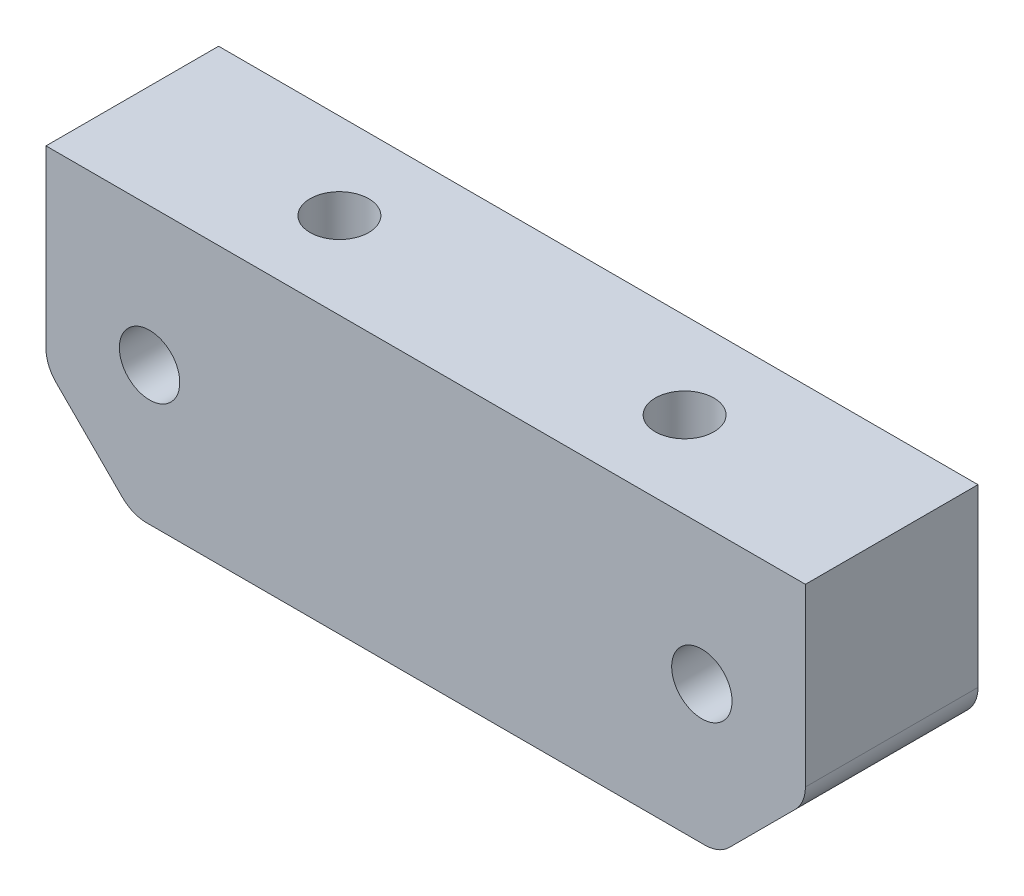
ISO-10303-21;
HEADER;
FILE_DESCRIPTION(('STEP AP214'),'2;1');
FILE_NAME('part.step','',(''),(''),'','','');
FILE_SCHEMA(('AUTOMOTIVE_DESIGN { 1 0 10303 214 1 1 1 1 }'));
ENDSEC;
DATA;
#1=APPLICATION_CONTEXT('core data for automotive mechanical design processes');
#2=APPLICATION_PROTOCOL_DEFINITION('international standard','automotive_design',2000,#1);
#3=PRODUCT_CONTEXT('',#1,'mechanical');
#4=PRODUCT('Part','Part','',(#3));
#5=PRODUCT_RELATED_PRODUCT_CATEGORY('part','',(#4));
#6=PRODUCT_DEFINITION_FORMATION('','',#4);
#7=PRODUCT_DEFINITION_CONTEXT('part definition',#1,'design');
#8=PRODUCT_DEFINITION('design','',#6,#7);
#9=PRODUCT_DEFINITION_SHAPE('','',#8);
#10=(LENGTH_UNIT() NAMED_UNIT(*) SI_UNIT(.MILLI.,.METRE.));
#11=(NAMED_UNIT(*) PLANE_ANGLE_UNIT() SI_UNIT($,.RADIAN.));
#12=(NAMED_UNIT(*) SI_UNIT($,.STERADIAN.) SOLID_ANGLE_UNIT());
#13=UNCERTAINTY_MEASURE_WITH_UNIT(LENGTH_MEASURE(1.E-05),#10,'distance_accuracy_value','');
#14=(GEOMETRIC_REPRESENTATION_CONTEXT(3) GLOBAL_UNCERTAINTY_ASSIGNED_CONTEXT((#13)) GLOBAL_UNIT_ASSIGNED_CONTEXT((#10,
#11,#12)) REPRESENTATION_CONTEXT('',''));
#15=CARTESIAN_POINT('',(0.,0.,0.));
#16=DIRECTION('',(0.,0.,1.));
#17=DIRECTION('',(1.,0.,0.));
#18=AXIS2_PLACEMENT_3D('',#15,#16,#17);
#19=CARTESIAN_POINT('',(10.,17.,5.));
#20=DIRECTION('',(0.,-1.,0.));
#21=DIRECTION('',(0.,0.,-1.));
#22=AXIS2_PLACEMENT_3D('',#19,#20,#21);
#23=CYLINDRICAL_SURFACE('',#22,1.7);
#24=CARTESIAN_POINT('',(10.,8.,5.));
#25=DIRECTION('',(0.,-1.,0.));
#26=DIRECTION('',(0.,0.,-1.));
#27=AXIS2_PLACEMENT_3D('',#24,#25,#26);
#28=CIRCLE('',#27,1.7);
#29=CARTESIAN_POINT('',(10.,8.,3.30000000000001));
#30=VERTEX_POINT('',#29);
#31=EDGE_CURVE('E166',#30,#30,#28,.T.);
#32=ORIENTED_EDGE('',*,*,#31,.F.);
#33=EDGE_LOOP('',(#32));
#34=FACE_BOUND('',#33,.T.);
#35=CARTESIAN_POINT('',(10.,-4.,5.));
#36=DIRECTION('',(0.,-1.,0.));
#37=DIRECTION('',(0.,0.,-1.));
#38=AXIS2_PLACEMENT_3D('',#35,#36,#37);
#39=CIRCLE('',#38,1.7);
#40=CARTESIAN_POINT('',(10.,-4.,3.30000000000001));
#41=VERTEX_POINT('',#40);
#42=EDGE_CURVE('E43',#41,#41,#39,.F.);
#43=ORIENTED_EDGE('',*,*,#42,.F.);
#44=EDGE_LOOP('',(#43));
#45=FACE_BOUND('',#44,.T.);
#46=ADVANCED_FACE('F39',(#34,#45),#23,.F.);
#47=CARTESIAN_POINT('',(-10.,17.,5.));
#48=DIRECTION('',(0.,-1.,0.));
#49=DIRECTION('',(0.,0.,-1.));
#50=AXIS2_PLACEMENT_3D('',#47,#48,#49);
#51=CYLINDRICAL_SURFACE('',#50,1.7);
#52=CARTESIAN_POINT('',(-10.,8.,5.));
#53=DIRECTION('',(0.,-1.,0.));
#54=DIRECTION('',(0.,0.,-1.));
#55=AXIS2_PLACEMENT_3D('',#52,#53,#54);
#56=CIRCLE('',#55,1.7);
#57=CARTESIAN_POINT('',(-10.,8.,3.3));
#58=VERTEX_POINT('',#57);
#59=EDGE_CURVE('E256',#58,#58,#56,.T.);
#60=ORIENTED_EDGE('',*,*,#59,.F.);
#61=EDGE_LOOP('',(#60));
#62=FACE_BOUND('',#61,.T.);
#63=CARTESIAN_POINT('',(-10.,-4.,5.));
#64=DIRECTION('',(0.,-1.,0.));
#65=DIRECTION('',(0.,0.,-1.));
#66=AXIS2_PLACEMENT_3D('',#63,#64,#65);
#67=CIRCLE('',#66,1.7);
#68=CARTESIAN_POINT('',(-10.,-4.,3.3));
#69=VERTEX_POINT('',#68);
#70=EDGE_CURVE('E220',#69,#69,#67,.F.);
#71=ORIENTED_EDGE('',*,*,#70,.F.);
#72=EDGE_LOOP('',(#71));
#73=FACE_BOUND('',#72,.T.);
#74=ADVANCED_FACE('F313',(#62,#73),#51,.F.);
#75=CARTESIAN_POINT('',(22.,-8.,10.));
#76=DIRECTION('',(-1.,0.,0.));
#77=DIRECTION('',(0.,0.,1.));
#78=AXIS2_PLACEMENT_3D('',#75,#76,#77);
#79=PLANE('',#78);
#80=DIRECTION('',(0.,1.,0.));
#81=VECTOR('',#80,1.);
#82=CARTESIAN_POINT('',(22.,-8.,10.));
#83=LINE('',#82,#81);
#84=CARTESIAN_POINT('',(22.,-2.17157287525379,10.));
#85=VERTEX_POINT('',#84);
#86=CARTESIAN_POINT('',(22.,8.,10.));
#87=VERTEX_POINT('',#86);
#88=EDGE_CURVE('E117',#85,#87,#83,.T.);
#89=ORIENTED_EDGE('',*,*,#88,.F.);
#90=DIRECTION('',(0.,0.,1.));
#91=VECTOR('',#90,1.);
#92=CARTESIAN_POINT('',(22.,-2.17157287525379,0.));
#93=LINE('',#92,#91);
#94=CARTESIAN_POINT('',(22.,-2.17157287525379,0.));
#95=VERTEX_POINT('',#94);
#96=EDGE_CURVE('E177',#85,#95,#93,.F.);
#97=ORIENTED_EDGE('',*,*,#96,.T.);
#98=DIRECTION('',(0.,1.,0.));
#99=VECTOR('',#98,1.);
#100=CARTESIAN_POINT('',(22.,-8.,0.));
#101=LINE('',#100,#99);
#102=CARTESIAN_POINT('',(22.,8.,0.));
#103=VERTEX_POINT('',#102);
#104=EDGE_CURVE('E144',#95,#103,#101,.T.);
#105=ORIENTED_EDGE('',*,*,#104,.T.);
#106=DIRECTION('',(0.,0.,-1.));
#107=VECTOR('',#106,1.);
#108=CARTESIAN_POINT('',(22.,8.,10.));
#109=LINE('',#108,#107);
#110=EDGE_CURVE('E135',#87,#103,#109,.T.);
#111=ORIENTED_EDGE('',*,*,#110,.F.);
#112=EDGE_LOOP('',(#89,#97,#105,#111));
#113=FACE_BOUND('',#112,.T.);
#114=ADVANCED_FACE('F142',(#113),#79,.F.);
#115=CARTESIAN_POINT('',(-22.,8.,10.));
#116=DIRECTION('',(0.,-1.,0.));
#117=DIRECTION('',(0.,0.,-1.));
#118=AXIS2_PLACEMENT_3D('',#115,#116,#117);
#119=PLANE('',#118);
#120=ORIENTED_EDGE('',*,*,#59,.T.);
#121=EDGE_LOOP('',(#120));
#122=FACE_BOUND('',#121,.T.);
#123=ORIENTED_EDGE('',*,*,#31,.T.);
#124=EDGE_LOOP('',(#123));
#125=FACE_BOUND('',#124,.T.);
#126=DIRECTION('',(-1.,0.,0.));
#127=VECTOR('',#126,1.);
#128=CARTESIAN_POINT('',(-22.,8.,0.));
#129=LINE('',#128,#127);
#130=CARTESIAN_POINT('',(-22.,8.,0.));
#131=VERTEX_POINT('',#130);
#132=EDGE_CURVE('E267',#103,#131,#129,.T.);
#133=ORIENTED_EDGE('',*,*,#132,.T.);
#134=DIRECTION('',(0.,0.,-1.));
#135=VECTOR('',#134,1.);
#136=CARTESIAN_POINT('',(-22.,8.,10.));
#137=LINE('',#136,#135);
#138=CARTESIAN_POINT('',(-22.,8.,10.));
#139=VERTEX_POINT('',#138);
#140=EDGE_CURVE('E137',#139,#131,#137,.T.);
#141=ORIENTED_EDGE('',*,*,#140,.F.);
#142=DIRECTION('',(-1.,0.,0.));
#143=VECTOR('',#142,1.);
#144=CARTESIAN_POINT('',(-22.,8.,10.));
#145=LINE('',#144,#143);
#146=EDGE_CURVE('E121',#87,#139,#145,.T.);
#147=ORIENTED_EDGE('',*,*,#146,.F.);
#148=ORIENTED_EDGE('',*,*,#110,.T.);
#149=EDGE_LOOP('',(#133,#141,#147,#148));
#150=FACE_BOUND('',#149,.T.);
#151=ADVANCED_FACE('F134',(#122,#125,#150),#119,.F.);
#152=CARTESIAN_POINT('',(-22.,-8.,10.));
#153=DIRECTION('',(1.,0.,0.));
#154=DIRECTION('',(0.,0.,-1.));
#155=AXIS2_PLACEMENT_3D('',#152,#153,#154);
#156=PLANE('',#155);
#157=DIRECTION('',(0.,-1.,0.));
#158=VECTOR('',#157,1.);
#159=CARTESIAN_POINT('',(-22.,-8.,0.));
#160=LINE('',#159,#158);
#161=CARTESIAN_POINT('',(-22.,-2.17157287525379,0.));
#162=VERTEX_POINT('',#161);
#163=EDGE_CURVE('E270',#131,#162,#160,.T.);
#164=ORIENTED_EDGE('',*,*,#163,.T.);
#165=DIRECTION('',(0.,0.,-1.));
#166=VECTOR('',#165,1.);
#167=CARTESIAN_POINT('',(-22.,-2.17157287525379,10.));
#168=LINE('',#167,#166);
#169=CARTESIAN_POINT('',(-22.,-2.17157287525379,10.));
#170=VERTEX_POINT('',#169);
#171=EDGE_CURVE('E11',#162,#170,#168,.F.);
#172=ORIENTED_EDGE('',*,*,#171,.T.);
#173=DIRECTION('',(0.,-1.,0.));
#174=VECTOR('',#173,1.);
#175=CARTESIAN_POINT('',(-22.,-8.,10.));
#176=LINE('',#175,#174);
#177=EDGE_CURVE('E140',#139,#170,#176,.T.);
#178=ORIENTED_EDGE('',*,*,#177,.F.);
#179=ORIENTED_EDGE('',*,*,#140,.T.);
#180=EDGE_LOOP('',(#164,#172,#178,#179));
#181=FACE_BOUND('',#180,.T.);
#182=ADVANCED_FACE('F296',(#181),#156,.F.);
#183=CARTESIAN_POINT('',(-22.,-8.,10.));
#184=DIRECTION('',(0.,1.,0.));
#185=DIRECTION('',(0.,0.,1.));
#186=AXIS2_PLACEMENT_3D('',#183,#184,#185);
#187=PLANE('',#186);
#188=CARTESIAN_POINT('',(10.,-8.,5.));
#189=DIRECTION('',(0.,-1.,0.));
#190=DIRECTION('',(0.,0.,-1.));
#191=AXIS2_PLACEMENT_3D('',#188,#189,#190);
#192=CIRCLE('',#191,3.5);
#193=CARTESIAN_POINT('',(10.,-8.,1.5));
#194=VERTEX_POINT('',#193);
#195=EDGE_CURVE('E231',#194,#194,#192,.T.);
#196=ORIENTED_EDGE('',*,*,#195,.F.);
#197=EDGE_LOOP('',(#196));
#198=FACE_BOUND('',#197,.T.);
#199=CARTESIAN_POINT('',(-10.,-8.,5.));
#200=DIRECTION('',(0.,-1.,0.));
#201=DIRECTION('',(0.,0.,-1.));
#202=AXIS2_PLACEMENT_3D('',#199,#200,#201);
#203=CIRCLE('',#202,3.5);
#204=CARTESIAN_POINT('',(-10.,-8.,1.5));
#205=VERTEX_POINT('',#204);
#206=EDGE_CURVE('E243',#205,#205,#203,.T.);
#207=ORIENTED_EDGE('',*,*,#206,.F.);
#208=EDGE_LOOP('',(#207));
#209=FACE_BOUND('',#208,.T.);
#210=DIRECTION('',(1.,0.,0.));
#211=VECTOR('',#210,1.);
#212=CARTESIAN_POINT('',(-22.,-8.,0.));
#213=LINE('',#212,#211);
#214=CARTESIAN_POINT('',(-16.1715728752538,-8.,0.));
#215=VERTEX_POINT('',#214);
#216=CARTESIAN_POINT('',(16.1715728752538,-8.,0.));
#217=VERTEX_POINT('',#216);
#218=EDGE_CURVE('E130',#215,#217,#213,.T.);
#219=ORIENTED_EDGE('',*,*,#218,.T.);
#220=DIRECTION('',(0.,0.,-1.));
#221=VECTOR('',#220,1.);
#222=CARTESIAN_POINT('',(16.1715728752538,-8.,10.));
#223=LINE('',#222,#221);
#224=CARTESIAN_POINT('',(16.1715728752538,-8.,10.));
#225=VERTEX_POINT('',#224);
#226=EDGE_CURVE('E212',#217,#225,#223,.F.);
#227=ORIENTED_EDGE('',*,*,#226,.T.);
#228=DIRECTION('',(1.,0.,0.));
#229=VECTOR('',#228,1.);
#230=CARTESIAN_POINT('',(-22.,-8.,10.));
#231=LINE('',#230,#229);
#232=CARTESIAN_POINT('',(-16.1715728752538,-8.,10.));
#233=VERTEX_POINT('',#232);
#234=EDGE_CURVE('E154',#233,#225,#231,.T.);
#235=ORIENTED_EDGE('',*,*,#234,.F.);
#236=DIRECTION('',(0.,0.,1.));
#237=VECTOR('',#236,1.);
#238=CARTESIAN_POINT('',(-16.1715728752538,-8.,0.));
#239=LINE('',#238,#237);
#240=EDGE_CURVE('E208',#233,#215,#239,.F.);
#241=ORIENTED_EDGE('',*,*,#240,.T.);
#242=EDGE_LOOP('',(#219,#227,#235,#241));
#243=FACE_BOUND('',#242,.T.);
#244=ADVANCED_FACE('F278',(#198,#209,#243),#187,.F.);
#245=CARTESIAN_POINT('',(0.,0.,10.));
#246=DIRECTION('',(0.,0.,-1.));
#247=DIRECTION('',(-1.,0.,0.));
#248=AXIS2_PLACEMENT_3D('',#245,#246,#247);
#249=PLANE('',#248);
#250=CARTESIAN_POINT('',(-16.,0.,10.));
#251=DIRECTION('',(0.,0.,1.));
#252=DIRECTION('',(1.,0.,0.));
#253=AXIS2_PLACEMENT_3D('',#250,#251,#252);
#254=CIRCLE('',#253,1.75);
#255=CARTESIAN_POINT('',(-14.25,0.,10.));
#256=VERTEX_POINT('',#255);
#257=EDGE_CURVE('E163',#256,#256,#254,.T.);
#258=ORIENTED_EDGE('',*,*,#257,.F.);
#259=EDGE_LOOP('',(#258));
#260=FACE_BOUND('',#259,.T.);
#261=CARTESIAN_POINT('',(16.,0.,10.));
#262=DIRECTION('',(0.,0.,1.));
#263=DIRECTION('',(-1.,0.,0.));
#264=AXIS2_PLACEMENT_3D('',#261,#262,#263);
#265=CIRCLE('',#264,1.75);
#266=CARTESIAN_POINT('',(14.25,0.,10.));
#267=VERTEX_POINT('',#266);
#268=EDGE_CURVE('E229',#267,#267,#265,.T.);
#269=ORIENTED_EDGE('',*,*,#268,.F.);
#270=EDGE_LOOP('',(#269));
#271=FACE_BOUND('',#270,.T.);
#272=DIRECTION('',(-0.707106781186549,-0.707106781186547,0.));
#273=VECTOR('',#272,1.);
#274=CARTESIAN_POINT('',(22.,-2.99999999999999,10.));
#275=LINE('',#274,#273);
#276=CARTESIAN_POINT('',(17.5857864376269,-7.4142135623731,10.));
#277=VERTEX_POINT('',#276);
#278=CARTESIAN_POINT('',(21.4142135623731,-3.58578643762689,10.));
#279=VERTEX_POINT('',#278);
#280=EDGE_CURVE('E174',#277,#279,#275,.F.);
#281=ORIENTED_EDGE('',*,*,#280,.T.);
#282=CARTESIAN_POINT('',(20.,-2.17157287525379,10.));
#283=DIRECTION('',(0.,0.,-1.));
#284=DIRECTION('',(-1.,0.,0.));
#285=AXIS2_PLACEMENT_3D('',#282,#283,#284);
#286=CIRCLE('',#285,2.);
#287=EDGE_CURVE('E124',#279,#85,#286,.F.);
#288=ORIENTED_EDGE('',*,*,#287,.T.);
#289=ORIENTED_EDGE('',*,*,#88,.T.);
#290=ORIENTED_EDGE('',*,*,#146,.T.);
#291=ORIENTED_EDGE('',*,*,#177,.T.);
#292=CARTESIAN_POINT('',(-20.,-2.17157287525379,10.));
#293=DIRECTION('',(0.,0.,-1.));
#294=DIRECTION('',(-1.,0.,0.));
#295=AXIS2_PLACEMENT_3D('',#292,#293,#294);
#296=CIRCLE('',#295,2.);
#297=CARTESIAN_POINT('',(-21.4142135623731,-3.58578643762688,10.));
#298=VERTEX_POINT('',#297);
#299=EDGE_CURVE('E63',#170,#298,#296,.F.);
#300=ORIENTED_EDGE('',*,*,#299,.T.);
#301=DIRECTION('',(-0.707106781186546,0.707106781186549,0.));
#302=VECTOR('',#301,1.);
#303=CARTESIAN_POINT('',(-17.,-8.,10.));
#304=LINE('',#303,#302);
#305=CARTESIAN_POINT('',(-17.5857864376269,-7.41421356237309,10.));
#306=VERTEX_POINT('',#305);
#307=EDGE_CURVE('E171',#298,#306,#304,.F.);
#308=ORIENTED_EDGE('',*,*,#307,.T.);
#309=CARTESIAN_POINT('',(-16.1715728752538,-6.,10.));
#310=DIRECTION('',(0.,0.,-1.));
#311=DIRECTION('',(-1.,0.,0.));
#312=AXIS2_PLACEMENT_3D('',#309,#310,#311);
#313=CIRCLE('',#312,2.);
#314=EDGE_CURVE('E200',#306,#233,#313,.F.);
#315=ORIENTED_EDGE('',*,*,#314,.T.);
#316=ORIENTED_EDGE('',*,*,#234,.T.);
#317=CARTESIAN_POINT('',(16.1715728752538,-6.,10.));
#318=DIRECTION('',(0.,0.,-1.));
#319=DIRECTION('',(-1.,0.,0.));
#320=AXIS2_PLACEMENT_3D('',#317,#318,#319);
#321=CIRCLE('',#320,2.);
#322=EDGE_CURVE('E203',#225,#277,#321,.F.);
#323=ORIENTED_EDGE('',*,*,#322,.T.);
#324=EDGE_LOOP('',(#281,#288,#289,#290,#291,#300,#308,#315,#316,#323));
#325=FACE_BOUND('',#324,.T.);
#326=ADVANCED_FACE('F120',(#260,#271,#325),#249,.F.);
#327=CARTESIAN_POINT('',(0.,0.,0.));
#328=DIRECTION('',(0.,0.,-1.));
#329=DIRECTION('',(-1.,0.,0.));
#330=AXIS2_PLACEMENT_3D('',#327,#328,#329);
#331=PLANE('',#330);
#332=CARTESIAN_POINT('',(-16.,0.,0.));
#333=DIRECTION('',(0.,0.,-1.));
#334=DIRECTION('',(-1.,0.,0.));
#335=AXIS2_PLACEMENT_3D('',#332,#333,#334);
#336=CIRCLE('',#335,1.75);
#337=CARTESIAN_POINT('',(-17.75,0.,0.));
#338=VERTEX_POINT('',#337);
#339=EDGE_CURVE('E162',#338,#338,#336,.T.);
#340=ORIENTED_EDGE('',*,*,#339,.F.);
#341=EDGE_LOOP('',(#340));
#342=FACE_BOUND('',#341,.T.);
#343=CARTESIAN_POINT('',(16.,0.,0.));
#344=DIRECTION('',(0.,0.,-1.));
#345=DIRECTION('',(-1.,0.,0.));
#346=AXIS2_PLACEMENT_3D('',#343,#344,#345);
#347=CIRCLE('',#346,1.75);
#348=CARTESIAN_POINT('',(14.25,0.,0.));
#349=VERTEX_POINT('',#348);
#350=EDGE_CURVE('E158',#349,#349,#347,.T.);
#351=ORIENTED_EDGE('',*,*,#350,.F.);
#352=EDGE_LOOP('',(#351));
#353=FACE_BOUND('',#352,.T.);
#354=ORIENTED_EDGE('',*,*,#104,.F.);
#355=CARTESIAN_POINT('',(20.,-2.17157287525379,0.));
#356=DIRECTION('',(0.,0.,-1.));
#357=DIRECTION('',(-1.,0.,0.));
#358=AXIS2_PLACEMENT_3D('',#355,#356,#357);
#359=CIRCLE('',#358,2.);
#360=CARTESIAN_POINT('',(21.4142135623731,-3.58578643762689,0.));
#361=VERTEX_POINT('',#360);
#362=EDGE_CURVE('E189',#95,#361,#359,.T.);
#363=ORIENTED_EDGE('',*,*,#362,.T.);
#364=DIRECTION('',(0.707106781186549,0.707106781186547,0.));
#365=VECTOR('',#364,1.);
#366=CARTESIAN_POINT('',(12.5,-12.5,0.));
#367=LINE('',#366,#365);
#368=CARTESIAN_POINT('',(17.5857864376269,-7.4142135623731,0.));
#369=VERTEX_POINT('',#368);
#370=EDGE_CURVE('E152',#361,#369,#367,.F.);
#371=ORIENTED_EDGE('',*,*,#370,.T.);
#372=CARTESIAN_POINT('',(16.1715728752538,-6.,0.));
#373=DIRECTION('',(0.,0.,-1.));
#374=DIRECTION('',(-1.,0.,0.));
#375=AXIS2_PLACEMENT_3D('',#372,#373,#374);
#376=CIRCLE('',#375,2.);
#377=EDGE_CURVE('E186',#369,#217,#376,.T.);
#378=ORIENTED_EDGE('',*,*,#377,.T.);
#379=ORIENTED_EDGE('',*,*,#218,.F.);
#380=CARTESIAN_POINT('',(-16.1715728752538,-6.,0.));
#381=DIRECTION('',(0.,0.,-1.));
#382=DIRECTION('',(-1.,0.,0.));
#383=AXIS2_PLACEMENT_3D('',#380,#381,#382);
#384=CIRCLE('',#383,2.);
#385=CARTESIAN_POINT('',(-17.5857864376269,-7.41421356237309,0.));
#386=VERTEX_POINT('',#385);
#387=EDGE_CURVE('E183',#215,#386,#384,.T.);
#388=ORIENTED_EDGE('',*,*,#387,.T.);
#389=DIRECTION('',(0.707106781186546,-0.707106781186549,0.));
#390=VECTOR('',#389,1.);
#391=CARTESIAN_POINT('',(-12.5,-12.5,0.));
#392=LINE('',#391,#390);
#393=CARTESIAN_POINT('',(-21.4142135623731,-3.58578643762688,0.));
#394=VERTEX_POINT('',#393);
#395=EDGE_CURVE('E147',#386,#394,#392,.F.);
#396=ORIENTED_EDGE('',*,*,#395,.T.);
#397=CARTESIAN_POINT('',(-20.,-2.17157287525379,0.));
#398=DIRECTION('',(0.,0.,-1.));
#399=DIRECTION('',(-1.,0.,0.));
#400=AXIS2_PLACEMENT_3D('',#397,#398,#399);
#401=CIRCLE('',#400,2.);
#402=EDGE_CURVE('E180',#394,#162,#401,.T.);
#403=ORIENTED_EDGE('',*,*,#402,.T.);
#404=ORIENTED_EDGE('',*,*,#163,.F.);
#405=ORIENTED_EDGE('',*,*,#132,.F.);
#406=EDGE_LOOP('',(#354,#363,#371,#378,#379,#388,#396,#403,#404,#405));
#407=FACE_BOUND('',#406,.T.);
#408=ADVANCED_FACE('F293',(#342,#353,#407),#331,.T.);
#409=CARTESIAN_POINT('',(16.,0.,-15.));
#410=DIRECTION('',(0.,0.,1.));
#411=DIRECTION('',(1.,0.,0.));
#412=AXIS2_PLACEMENT_3D('',#409,#410,#411);
#413=CYLINDRICAL_SURFACE('',#412,1.75);
#414=ORIENTED_EDGE('',*,*,#350,.T.);
#415=EDGE_LOOP('',(#414));
#416=FACE_BOUND('',#415,.T.);
#417=ORIENTED_EDGE('',*,*,#268,.T.);
#418=EDGE_LOOP('',(#417));
#419=FACE_BOUND('',#418,.T.);
#420=ADVANCED_FACE('F330',(#416,#419),#413,.F.);
#421=CARTESIAN_POINT('',(-16.,0.,-15.));
#422=DIRECTION('',(0.,0.,1.));
#423=DIRECTION('',(1.,0.,0.));
#424=AXIS2_PLACEMENT_3D('',#421,#422,#423);
#425=CYLINDRICAL_SURFACE('',#424,1.75);
#426=ORIENTED_EDGE('',*,*,#339,.T.);
#427=EDGE_LOOP('',(#426));
#428=FACE_BOUND('',#427,.T.);
#429=ORIENTED_EDGE('',*,*,#257,.T.);
#430=EDGE_LOOP('',(#429));
#431=FACE_BOUND('',#430,.T.);
#432=ADVANCED_FACE('F344',(#428,#431),#425,.F.);
#433=CARTESIAN_POINT('',(22.,-2.99999999999999,10.));
#434=DIRECTION('',(-0.707106781186547,0.707106781186549,0.));
#435=DIRECTION('',(0.,0.,-1.));
#436=AXIS2_PLACEMENT_3D('',#433,#434,#435);
#437=PLANE('',#436);
#438=ORIENTED_EDGE('',*,*,#370,.F.);
#439=DIRECTION('',(0.,0.,-1.));
#440=VECTOR('',#439,1.);
#441=CARTESIAN_POINT('',(21.4142135623731,-3.58578643762689,10.));
#442=LINE('',#441,#440);
#443=EDGE_CURVE('E195',#361,#279,#442,.F.);
#444=ORIENTED_EDGE('',*,*,#443,.T.);
#445=ORIENTED_EDGE('',*,*,#280,.F.);
#446=DIRECTION('',(0.,0.,1.));
#447=VECTOR('',#446,1.);
#448=CARTESIAN_POINT('',(17.5857864376269,-7.41421356237309,0.));
#449=LINE('',#448,#447);
#450=EDGE_CURVE('E192',#277,#369,#449,.F.);
#451=ORIENTED_EDGE('',*,*,#450,.T.);
#452=EDGE_LOOP('',(#438,#444,#445,#451));
#453=FACE_BOUND('',#452,.T.);
#454=ADVANCED_FACE('F289',(#453),#437,.F.);
#455=CARTESIAN_POINT('',(-17.,-8.,10.));
#456=DIRECTION('',(0.707106781186549,0.707106781186546,0.));
#457=DIRECTION('',(0.,0.,-1.));
#458=AXIS2_PLACEMENT_3D('',#455,#456,#457);
#459=PLANE('',#458);
#460=ORIENTED_EDGE('',*,*,#395,.F.);
#461=DIRECTION('',(0.,0.,-1.));
#462=VECTOR('',#461,1.);
#463=CARTESIAN_POINT('',(-17.5857864376269,-7.41421356237309,10.));
#464=LINE('',#463,#462);
#465=EDGE_CURVE('E49',#386,#306,#464,.F.);
#466=ORIENTED_EDGE('',*,*,#465,.T.);
#467=ORIENTED_EDGE('',*,*,#307,.F.);
#468=DIRECTION('',(0.,0.,1.));
#469=VECTOR('',#468,1.);
#470=CARTESIAN_POINT('',(-21.4142135623731,-3.58578643762688,0.));
#471=LINE('',#470,#469);
#472=EDGE_CURVE('E216',#298,#394,#471,.F.);
#473=ORIENTED_EDGE('',*,*,#472,.T.);
#474=EDGE_LOOP('',(#460,#466,#467,#473));
#475=FACE_BOUND('',#474,.T.);
#476=ADVANCED_FACE('F301',(#475),#459,.F.);
#477=CARTESIAN_POINT('',(20.,-2.17157287525379,10.));
#478=DIRECTION('',(0.,0.,-1.));
#479=DIRECTION('',(-1.,0.,0.));
#480=AXIS2_PLACEMENT_3D('',#477,#478,#479);
#481=CYLINDRICAL_SURFACE('',#480,2.);
#482=ORIENTED_EDGE('',*,*,#287,.F.);
#483=ORIENTED_EDGE('',*,*,#443,.F.);
#484=ORIENTED_EDGE('',*,*,#362,.F.);
#485=ORIENTED_EDGE('',*,*,#96,.F.);
#486=EDGE_LOOP('',(#482,#483,#484,#485));
#487=FACE_BOUND('',#486,.T.);
#488=ADVANCED_FACE('F292',(#487),#481,.T.);
#489=CARTESIAN_POINT('',(16.1715728752538,-6.,10.));
#490=DIRECTION('',(0.,0.,1.));
#491=DIRECTION('',(1.,0.,0.));
#492=AXIS2_PLACEMENT_3D('',#489,#490,#491);
#493=CYLINDRICAL_SURFACE('',#492,2.);
#494=ORIENTED_EDGE('',*,*,#377,.F.);
#495=ORIENTED_EDGE('',*,*,#450,.F.);
#496=ORIENTED_EDGE('',*,*,#322,.F.);
#497=ORIENTED_EDGE('',*,*,#226,.F.);
#498=EDGE_LOOP('',(#494,#495,#496,#497));
#499=FACE_BOUND('',#498,.T.);
#500=ADVANCED_FACE('F284',(#499),#493,.T.);
#501=CARTESIAN_POINT('',(-16.1715728752538,-6.,10.));
#502=DIRECTION('',(0.,0.,-1.));
#503=DIRECTION('',(-1.,0.,0.));
#504=AXIS2_PLACEMENT_3D('',#501,#502,#503);
#505=CYLINDRICAL_SURFACE('',#504,2.);
#506=ORIENTED_EDGE('',*,*,#314,.F.);
#507=ORIENTED_EDGE('',*,*,#465,.F.);
#508=ORIENTED_EDGE('',*,*,#387,.F.);
#509=ORIENTED_EDGE('',*,*,#240,.F.);
#510=EDGE_LOOP('',(#506,#507,#508,#509));
#511=FACE_BOUND('',#510,.T.);
#512=ADVANCED_FACE('F304',(#511),#505,.T.);
#513=CARTESIAN_POINT('',(-20.,-2.17157287525379,10.));
#514=DIRECTION('',(0.,0.,1.));
#515=DIRECTION('',(1.,0.,0.));
#516=AXIS2_PLACEMENT_3D('',#513,#514,#515);
#517=CYLINDRICAL_SURFACE('',#516,2.);
#518=ORIENTED_EDGE('',*,*,#402,.F.);
#519=ORIENTED_EDGE('',*,*,#472,.F.);
#520=ORIENTED_EDGE('',*,*,#299,.F.);
#521=ORIENTED_EDGE('',*,*,#171,.F.);
#522=EDGE_LOOP('',(#518,#519,#520,#521));
#523=FACE_BOUND('',#522,.T.);
#524=ADVANCED_FACE('F41',(#523),#517,.T.);
#525=CARTESIAN_POINT('',(-10.,-4.,5.));
#526=DIRECTION('',(0.,-1.,0.));
#527=DIRECTION('',(0.,0.,-1.));
#528=AXIS2_PLACEMENT_3D('',#525,#526,#527);
#529=PLANE('',#528);
#530=CARTESIAN_POINT('',(-10.,-4.,5.));
#531=DIRECTION('',(0.,-1.,0.));
#532=DIRECTION('',(0.,0.,-1.));
#533=AXIS2_PLACEMENT_3D('',#530,#531,#532);
#534=CIRCLE('',#533,3.5);
#535=CARTESIAN_POINT('',(-10.,-4.,1.5));
#536=VERTEX_POINT('',#535);
#537=EDGE_CURVE('E237',#536,#536,#534,.T.);
#538=ORIENTED_EDGE('',*,*,#537,.T.);
#539=EDGE_LOOP('',(#538));
#540=FACE_BOUND('',#539,.T.);
#541=ORIENTED_EDGE('',*,*,#70,.T.);
#542=EDGE_LOOP('',(#541));
#543=FACE_BOUND('',#542,.T.);
#544=ADVANCED_FACE('F310',(#540,#543),#529,.T.);
#545=CARTESIAN_POINT('',(-10.,-4.,5.));
#546=DIRECTION('',(0.,-1.,0.));
#547=DIRECTION('',(0.,0.,-1.));
#548=AXIS2_PLACEMENT_3D('',#545,#546,#547);
#549=CYLINDRICAL_SURFACE('',#548,3.5);
#550=ORIENTED_EDGE('',*,*,#537,.F.);
#551=EDGE_LOOP('',(#550));
#552=FACE_BOUND('',#551,.T.);
#553=ORIENTED_EDGE('',*,*,#206,.T.);
#554=EDGE_LOOP('',(#553));
#555=FACE_BOUND('',#554,.T.);
#556=ADVANCED_FACE('F393',(#552,#555),#549,.F.);
#557=CARTESIAN_POINT('',(10.,-4.,5.));
#558=DIRECTION('',(0.,-1.,0.));
#559=DIRECTION('',(0.,0.,-1.));
#560=AXIS2_PLACEMENT_3D('',#557,#558,#559);
#561=PLANE('',#560);
#562=CARTESIAN_POINT('',(10.,-4.,5.));
#563=DIRECTION('',(0.,-1.,0.));
#564=DIRECTION('',(0.,0.,-1.));
#565=AXIS2_PLACEMENT_3D('',#562,#563,#564);
#566=CIRCLE('',#565,3.5);
#567=CARTESIAN_POINT('',(10.,-4.,1.5));
#568=VERTEX_POINT('',#567);
#569=EDGE_CURVE('E223',#568,#568,#566,.T.);
#570=ORIENTED_EDGE('',*,*,#569,.T.);
#571=EDGE_LOOP('',(#570));
#572=FACE_BOUND('',#571,.T.);
#573=ORIENTED_EDGE('',*,*,#42,.T.);
#574=EDGE_LOOP('',(#573));
#575=FACE_BOUND('',#574,.T.);
#576=ADVANCED_FACE('F403',(#572,#575),#561,.T.);
#577=CARTESIAN_POINT('',(10.,-4.,5.));
#578=DIRECTION('',(0.,-1.,0.));
#579=DIRECTION('',(0.,0.,-1.));
#580=AXIS2_PLACEMENT_3D('',#577,#578,#579);
#581=CYLINDRICAL_SURFACE('',#580,3.5);
#582=ORIENTED_EDGE('',*,*,#569,.F.);
#583=EDGE_LOOP('',(#582));
#584=FACE_BOUND('',#583,.T.);
#585=ORIENTED_EDGE('',*,*,#195,.T.);
#586=EDGE_LOOP('',(#585));
#587=FACE_BOUND('',#586,.T.);
#588=ADVANCED_FACE('F413',(#584,#587),#581,.F.);
#589=CLOSED_SHELL('',(#46,#74,#114,#151,#182,#244,#326,#408,#420,#432,#454,#476,#488,#500,#512,
#524,#544,#556,#576,#588));
#590=MANIFOLD_SOLID_BREP('B2',#589);
#591=ADVANCED_BREP_SHAPE_REPRESENTATION('',(#18,#590),#14);
#592=SHAPE_DEFINITION_REPRESENTATION(#9,#591);
ENDSEC;
END-ISO-10303-21;
